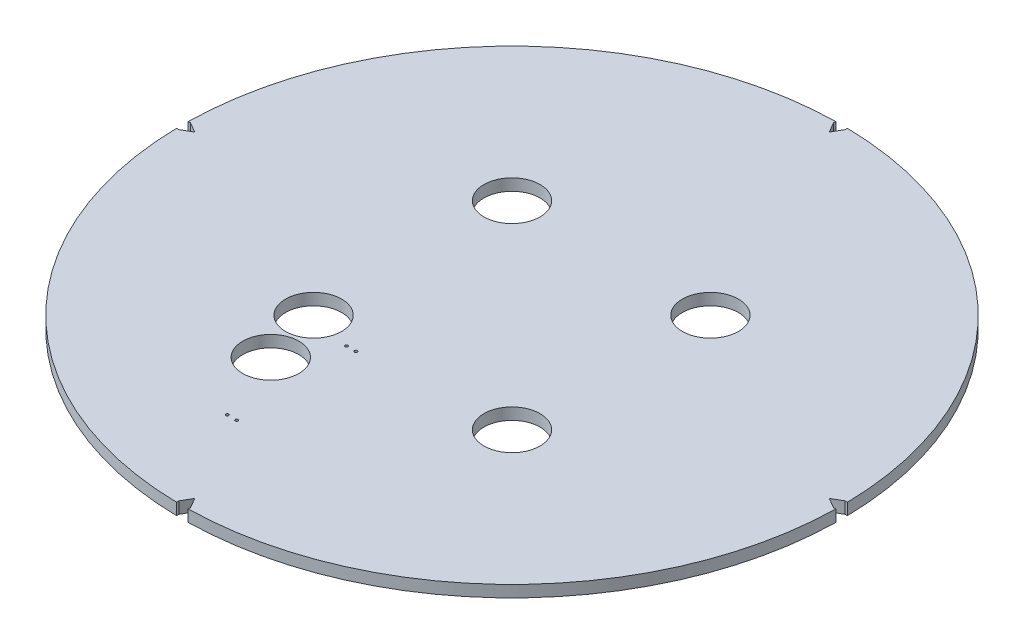
ISO-10303-21;
HEADER;
FILE_DESCRIPTION(('STEP AP214'),'2;1');
FILE_NAME('part.step','',(''),(''),'','','');
FILE_SCHEMA(('AUTOMOTIVE_DESIGN { 1 0 10303 214 1 1 1 1 }'));
ENDSEC;
DATA;
#1=APPLICATION_CONTEXT('core data for automotive mechanical design processes');
#2=APPLICATION_PROTOCOL_DEFINITION('international standard','automotive_design',2000,#1);
#3=PRODUCT_CONTEXT('',#1,'mechanical');
#4=PRODUCT('Part','Part','',(#3));
#5=PRODUCT_RELATED_PRODUCT_CATEGORY('part','',(#4));
#6=PRODUCT_DEFINITION_FORMATION('','',#4);
#7=PRODUCT_DEFINITION_CONTEXT('part definition',#1,'design');
#8=PRODUCT_DEFINITION('design','',#6,#7);
#9=PRODUCT_DEFINITION_SHAPE('','',#8);
#10=(LENGTH_UNIT() NAMED_UNIT(*) SI_UNIT(.MILLI.,.METRE.));
#11=(NAMED_UNIT(*) PLANE_ANGLE_UNIT() SI_UNIT($,.RADIAN.));
#12=(NAMED_UNIT(*) SI_UNIT($,.STERADIAN.) SOLID_ANGLE_UNIT());
#13=UNCERTAINTY_MEASURE_WITH_UNIT(LENGTH_MEASURE(1.E-05),#10,'distance_accuracy_value','');
#14=(GEOMETRIC_REPRESENTATION_CONTEXT(3) GLOBAL_UNCERTAINTY_ASSIGNED_CONTEXT((#13)) GLOBAL_UNIT_ASSIGNED_CONTEXT((#10,
#11,#12)) REPRESENTATION_CONTEXT('',''));
#15=CARTESIAN_POINT('',(0.,0.,0.));
#16=DIRECTION('',(0.,0.,1.));
#17=DIRECTION('',(1.,0.,0.));
#18=AXIS2_PLACEMENT_3D('',#15,#16,#17);
#19=CARTESIAN_POINT('',(0.,25.,0.));
#20=DIRECTION('',(0.,1.,0.));
#21=DIRECTION('',(0.,0.,1.));
#22=AXIS2_PLACEMENT_3D('',#19,#20,#21);
#23=PLANE('',#22);
#24=CARTESIAN_POINT('',(-119.993569405085,25.,488.765285361642));
#25=DIRECTION('',(0.,1.,0.));
#26=DIRECTION('',(0.,0.,1.));
#27=AXIS2_PLACEMENT_3D('',#24,#25,#26);
#28=CIRCLE('',#27,3.00000000000001);
#29=CARTESIAN_POINT('',(-119.993569405085,25.,491.765285361642));
#30=VERTEX_POINT('',#29);
#31=EDGE_CURVE('E478',#30,#30,#28,.F.);
#32=ORIENTED_EDGE('',*,*,#31,.T.);
#33=EDGE_LOOP('',(#32));
#34=FACE_BOUND('',#33,.T.);
#35=CARTESIAN_POINT('',(-119.993569405085,25.,233.765285361642));
#36=DIRECTION('',(0.,1.,0.));
#37=DIRECTION('',(0.,0.,1.));
#38=AXIS2_PLACEMENT_3D('',#35,#36,#37);
#39=CIRCLE('',#38,3.00000000000001);
#40=CARTESIAN_POINT('',(-119.993569405085,25.,236.765285361642));
#41=VERTEX_POINT('',#40);
#42=EDGE_CURVE('E484',#41,#41,#39,.F.);
#43=ORIENTED_EDGE('',*,*,#42,.T.);
#44=EDGE_LOOP('',(#43));
#45=FACE_BOUND('',#44,.T.);
#46=CARTESIAN_POINT('',(-179.993569405085,25.,335.765285361642));
#47=DIRECTION('',(0.,1.,0.));
#48=DIRECTION('',(0.,0.,1.));
#49=AXIS2_PLACEMENT_3D('',#46,#47,#48);
#50=CIRCLE('',#49,60.);
#51=CARTESIAN_POINT('',(-179.993569405085,25.,395.765285361642));
#52=VERTEX_POINT('',#51);
#53=EDGE_CURVE('E495',#52,#52,#50,.T.);
#54=ORIENTED_EDGE('',*,*,#53,.F.);
#55=EDGE_LOOP('',(#54));
#56=FACE_BOUND('',#55,.T.);
#57=CARTESIAN_POINT('',(212.132034355964,25.,-212.132034355964));
#58=DIRECTION('',(0.,1.,0.));
#59=DIRECTION('',(0.,0.,1.));
#60=AXIS2_PLACEMENT_3D('',#57,#58,#59);
#61=CIRCLE('',#60,60.);
#62=CARTESIAN_POINT('',(212.132034355964,25.,-152.132034355964));
#63=VERTEX_POINT('',#62);
#64=EDGE_CURVE('E501',#63,#63,#61,.T.);
#65=ORIENTED_EDGE('',*,*,#64,.F.);
#66=EDGE_LOOP('',(#65));
#67=FACE_BOUND('',#66,.T.);
#68=CARTESIAN_POINT('',(-212.132034355964,25.,-212.132034355964));
#69=DIRECTION('',(0.,1.,0.));
#70=DIRECTION('',(0.,0.,1.));
#71=AXIS2_PLACEMENT_3D('',#68,#69,#70);
#72=CIRCLE('',#71,60.);
#73=CARTESIAN_POINT('',(-212.132034355964,25.,-152.132034355964));
#74=VERTEX_POINT('',#73);
#75=EDGE_CURVE('E512',#74,#74,#72,.T.);
#76=ORIENTED_EDGE('',*,*,#75,.F.);
#77=EDGE_LOOP('',(#76));
#78=FACE_BOUND('',#77,.T.);
#79=CARTESIAN_POINT('',(-212.132034355964,25.,212.132034355964));
#80=DIRECTION('',(0.,1.,0.));
#81=DIRECTION('',(0.,0.,1.));
#82=AXIS2_PLACEMENT_3D('',#79,#80,#81);
#83=CIRCLE('',#82,60.);
#84=CARTESIAN_POINT('',(-212.132034355964,25.,272.132034355964));
#85=VERTEX_POINT('',#84);
#86=EDGE_CURVE('E504',#85,#85,#83,.T.);
#87=ORIENTED_EDGE('',*,*,#86,.F.);
#88=EDGE_LOOP('',(#87));
#89=FACE_BOUND('',#88,.T.);
#90=CARTESIAN_POINT('',(212.132034355964,25.,212.132034355964));
#91=DIRECTION('',(0.,1.,0.));
#92=DIRECTION('',(0.,0.,1.));
#93=AXIS2_PLACEMENT_3D('',#90,#91,#92);
#94=CIRCLE('',#93,60.);
#95=CARTESIAN_POINT('',(212.132034355964,25.,272.132034355964));
#96=VERTEX_POINT('',#95);
#97=EDGE_CURVE('E511',#96,#96,#94,.T.);
#98=ORIENTED_EDGE('',*,*,#97,.F.);
#99=EDGE_LOOP('',(#98));
#100=FACE_BOUND('',#99,.T.);
#101=DIRECTION('',(1.,0.,0.));
#102=VECTOR('',#101,1.);
#103=CARTESIAN_POINT('',(-699.994189271292,25.,12.4999999999935));
#104=LINE('',#103,#102);
#105=CARTESIAN_POINT('',(-704.889175686505,25.,12.4999999999935));
#106=VERTEX_POINT('',#105);
#107=CARTESIAN_POINT('',(-699.994189271292,25.,12.4999999999935));
#108=VERTEX_POINT('',#107);
#109=EDGE_CURVE('E214',#106,#108,#104,.T.);
#110=ORIENTED_EDGE('',*,*,#109,.F.);
#111=CARTESIAN_POINT('',(0.,25.,0.));
#112=DIRECTION('',(0.,1.,0.));
#113=DIRECTION('',(0.,0.,1.));
#114=AXIS2_PLACEMENT_3D('',#111,#112,#113);
#115=CIRCLE('',#114,705.);
#116=CARTESIAN_POINT('',(-12.5000000000039,25.,704.889175686505));
#117=VERTEX_POINT('',#116);
#118=EDGE_CURVE('E45',#106,#117,#115,.T.);
#119=ORIENTED_EDGE('',*,*,#118,.T.);
#120=DIRECTION('',(0.,0.,1.));
#121=VECTOR('',#120,1.);
#122=CARTESIAN_POINT('',(-12.5000000000039,25.,699.994189271326));
#123=LINE('',#122,#121);
#124=CARTESIAN_POINT('',(-12.5000000000039,25.,699.994189271326));
#125=VERTEX_POINT('',#124);
#126=EDGE_CURVE('E295',#125,#117,#123,.T.);
#127=ORIENTED_EDGE('',*,*,#126,.F.);
#128=DIRECTION('',(-0.500000000000008,0.,0.866025403784434));
#129=VECTOR('',#128,1.);
#130=CARTESIAN_POINT('',(1.75263706108031E-11,25.,678.343554176678));
#131=LINE('',#130,#129);
#132=CARTESIAN_POINT('',(1.75263706108031E-11,25.,678.343554176678));
#133=VERTEX_POINT('',#132);
#134=EDGE_CURVE('E292',#133,#125,#131,.T.);
#135=ORIENTED_EDGE('',*,*,#134,.F.);
#136=DIRECTION('',(-0.499999999999294,0.,-0.866025403784846));
#137=VECTOR('',#136,1.);
#138=CARTESIAN_POINT('',(12.499999999996,25.,699.994189271292));
#139=LINE('',#138,#137);
#140=CARTESIAN_POINT('',(12.499999999996,25.,699.994189271292));
#141=VERTEX_POINT('',#140);
#142=EDGE_CURVE('E301',#141,#133,#139,.T.);
#143=ORIENTED_EDGE('',*,*,#142,.F.);
#144=DIRECTION('',(0.,0.,-1.));
#145=VECTOR('',#144,1.);
#146=CARTESIAN_POINT('',(12.499999999996,25.,699.994189271292));
#147=LINE('',#146,#145);
#148=CARTESIAN_POINT('',(12.499999999996,25.,704.889175686505));
#149=VERTEX_POINT('',#148);
#150=EDGE_CURVE('E298',#149,#141,#147,.T.);
#151=ORIENTED_EDGE('',*,*,#150,.F.);
#152=CARTESIAN_POINT('',(704.889175686504,25.,12.5000000000113));
#153=VERTEX_POINT('',#152);
#154=EDGE_CURVE('E11',#149,#153,#115,.T.);
#155=ORIENTED_EDGE('',*,*,#154,.T.);
#156=DIRECTION('',(1.,0.,0.));
#157=VECTOR('',#156,1.);
#158=CARTESIAN_POINT('',(699.994189271326,25.,12.5000000000112));
#159=LINE('',#158,#157);
#160=CARTESIAN_POINT('',(699.994189271326,25.,12.5000000000112));
#161=VERTEX_POINT('',#160);
#162=EDGE_CURVE('E264',#161,#153,#159,.T.);
#163=ORIENTED_EDGE('',*,*,#162,.F.);
#164=DIRECTION('',(0.866025403784428,0.,0.500000000000017));
#165=VECTOR('',#164,1.);
#166=CARTESIAN_POINT('',(678.343554176678,25.,-1.04210990286059E-11));
#167=LINE('',#166,#165);
#168=CARTESIAN_POINT('',(678.343554176678,25.,-1.04210990286059E-11));
#169=VERTEX_POINT('',#168);
#170=EDGE_CURVE('E261',#169,#161,#167,.T.);
#171=ORIENTED_EDGE('',*,*,#170,.F.);
#172=DIRECTION('',(-0.866025403784851,0.,0.499999999999285));
#173=VECTOR('',#172,1.);
#174=CARTESIAN_POINT('',(699.994189271293,25.,-12.4999999999887));
#175=LINE('',#174,#173);
#176=CARTESIAN_POINT('',(699.994189271293,25.,-12.4999999999887));
#177=VERTEX_POINT('',#176);
#178=EDGE_CURVE('E269',#177,#169,#175,.T.);
#179=ORIENTED_EDGE('',*,*,#178,.F.);
#180=DIRECTION('',(-1.,0.,0.));
#181=VECTOR('',#180,1.);
#182=CARTESIAN_POINT('',(699.994189271293,25.,-12.4999999999887));
#183=LINE('',#182,#181);
#184=CARTESIAN_POINT('',(704.889175686505,25.,-12.4999999999886));
#185=VERTEX_POINT('',#184);
#186=EDGE_CURVE('E266',#185,#177,#183,.T.);
#187=ORIENTED_EDGE('',*,*,#186,.F.);
#188=CARTESIAN_POINT('',(12.5000000000039,25.,-704.889175686505));
#189=VERTEX_POINT('',#188);
#190=EDGE_CURVE('E44',#185,#189,#115,.T.);
#191=ORIENTED_EDGE('',*,*,#190,.T.);
#192=DIRECTION('',(0.,0.,-1.));
#193=VECTOR('',#192,1.);
#194=CARTESIAN_POINT('',(12.5000000000039,25.,-699.994189271326));
#195=LINE('',#194,#193);
#196=CARTESIAN_POINT('',(12.5000000000039,25.,-699.994189271326));
#197=VERTEX_POINT('',#196);
#198=EDGE_CURVE('E237',#197,#189,#195,.T.);
#199=ORIENTED_EDGE('',*,*,#198,.F.);
#200=DIRECTION('',(0.500000000000008,0.,-0.866025403784434));
#201=VECTOR('',#200,1.);
#202=CARTESIAN_POINT('',(-1.75263706108031E-11,25.,-678.343554176678));
#203=LINE('',#202,#201);
#204=CARTESIAN_POINT('',(-1.75263706108031E-11,25.,-678.343554176678));
#205=VERTEX_POINT('',#204);
#206=EDGE_CURVE('E234',#205,#197,#203,.T.);
#207=ORIENTED_EDGE('',*,*,#206,.F.);
#208=DIRECTION('',(0.499999999999294,0.,0.866025403784846));
#209=VECTOR('',#208,1.);
#210=CARTESIAN_POINT('',(-12.499999999996,25.,-699.994189271292));
#211=LINE('',#210,#209);
#212=CARTESIAN_POINT('',(-12.499999999996,25.,-699.994189271292));
#213=VERTEX_POINT('',#212);
#214=EDGE_CURVE('E242',#213,#205,#211,.T.);
#215=ORIENTED_EDGE('',*,*,#214,.F.);
#216=DIRECTION('',(0.,0.,1.));
#217=VECTOR('',#216,1.);
#218=CARTESIAN_POINT('',(-12.499999999996,25.,-699.994189271292));
#219=LINE('',#218,#217);
#220=CARTESIAN_POINT('',(-12.499999999996,25.,-704.889175686505));
#221=VERTEX_POINT('',#220);
#222=EDGE_CURVE('E239',#221,#213,#219,.T.);
#223=ORIENTED_EDGE('',*,*,#222,.F.);
#224=CARTESIAN_POINT('',(-704.889175686505,25.,-12.5000000000064));
#225=VERTEX_POINT('',#224);
#226=EDGE_CURVE('E330',#221,#225,#115,.T.);
#227=ORIENTED_EDGE('',*,*,#226,.T.);
#228=DIRECTION('',(-1.,0.,0.));
#229=VECTOR('',#228,1.);
#230=CARTESIAN_POINT('',(-699.994189271326,25.,-12.5000000000063));
#231=LINE('',#230,#229);
#232=CARTESIAN_POINT('',(-699.994189271326,25.,-12.5000000000063));
#233=VERTEX_POINT('',#232);
#234=EDGE_CURVE('E212',#233,#225,#231,.T.);
#235=ORIENTED_EDGE('',*,*,#234,.F.);
#236=DIRECTION('',(-0.866025403784432,0.,-0.500000000000011));
#237=VECTOR('',#236,1.);
#238=CARTESIAN_POINT('',(-678.343554176678,25.,1.51579467500707E-11));
#239=LINE('',#238,#237);
#240=CARTESIAN_POINT('',(-678.343554176678,25.,1.51579467500707E-11));
#241=VERTEX_POINT('',#240);
#242=EDGE_CURVE('E182',#241,#233,#239,.T.);
#243=ORIENTED_EDGE('',*,*,#242,.F.);
#244=DIRECTION('',(0.866025403784848,0.,-0.499999999999291));
#245=VECTOR('',#244,1.);
#246=CARTESIAN_POINT('',(-699.994189271292,25.,12.4999999999935));
#247=LINE('',#246,#245);
#248=EDGE_CURVE('E184',#108,#241,#247,.T.);
#249=ORIENTED_EDGE('',*,*,#248,.F.);
#250=EDGE_LOOP('',(#110,#119,#127,#135,#143,#151,#155,#163,#171,#179,#187,#191,#199,#207,#215,
#223,#227,#235,#243,#249));
#251=FACE_BOUND('',#250,.T.);
#252=CARTESIAN_POINT('',(-99.9935694050845,25.,488.765285361642));
#253=DIRECTION('',(0.,1.,0.));
#254=DIRECTION('',(0.,0.,1.));
#255=AXIS2_PLACEMENT_3D('',#252,#253,#254);
#256=CIRCLE('',#255,3.00000000000001);
#257=CARTESIAN_POINT('',(-99.9935694050845,25.,491.765285361642));
#258=VERTEX_POINT('',#257);
#259=EDGE_CURVE('E476',#258,#258,#256,.T.);
#260=ORIENTED_EDGE('',*,*,#259,.F.);
#261=EDGE_LOOP('',(#260));
#262=FACE_BOUND('',#261,.T.);
#263=CARTESIAN_POINT('',(-99.9935694050845,25.,233.765285361642));
#264=DIRECTION('',(0.,1.,0.));
#265=DIRECTION('',(0.,0.,1.));
#266=AXIS2_PLACEMENT_3D('',#263,#264,#265);
#267=CIRCLE('',#266,3.00000000000001);
#268=CARTESIAN_POINT('',(-99.9935694050845,25.,236.765285361642));
#269=VERTEX_POINT('',#268);
#270=EDGE_CURVE('E485',#269,#269,#267,.T.);
#271=ORIENTED_EDGE('',*,*,#270,.F.);
#272=EDGE_LOOP('',(#271));
#273=FACE_BOUND('',#272,.T.);
#274=ADVANCED_FACE('F35',(#34,#45,#56,#67,#78,#89,#100,#251,#262,#273),#23,.T.);
#275=CARTESIAN_POINT('',(0.,0.,0.));
#276=DIRECTION('',(0.,1.,0.));
#277=DIRECTION('',(0.,0.,1.));
#278=AXIS2_PLACEMENT_3D('',#275,#276,#277);
#279=PLANE('',#278);
#280=CARTESIAN_POINT('',(-99.9935694050845,0.,488.765285361642));
#281=DIRECTION('',(0.,1.,0.));
#282=DIRECTION('',(0.,0.,1.));
#283=AXIS2_PLACEMENT_3D('',#280,#281,#282);
#284=CIRCLE('',#283,3.00000000000001);
#285=CARTESIAN_POINT('',(-99.9935694050845,0.,491.765285361642));
#286=VERTEX_POINT('',#285);
#287=EDGE_CURVE('E473',#286,#286,#284,.T.);
#288=ORIENTED_EDGE('',*,*,#287,.T.);
#289=EDGE_LOOP('',(#288));
#290=FACE_BOUND('',#289,.T.);
#291=CARTESIAN_POINT('',(-119.993569405085,0.,233.765285361642));
#292=DIRECTION('',(0.,1.,0.));
#293=DIRECTION('',(0.,0.,1.));
#294=AXIS2_PLACEMENT_3D('',#291,#292,#293);
#295=CIRCLE('',#294,3.00000000000001);
#296=CARTESIAN_POINT('',(-119.993569405085,0.,236.765285361642));
#297=VERTEX_POINT('',#296);
#298=EDGE_CURVE('E492',#297,#297,#295,.F.);
#299=ORIENTED_EDGE('',*,*,#298,.F.);
#300=EDGE_LOOP('',(#299));
#301=FACE_BOUND('',#300,.T.);
#302=CARTESIAN_POINT('',(-179.993569405085,0.,335.765285361642));
#303=DIRECTION('',(0.,1.,0.));
#304=DIRECTION('',(0.,0.,1.));
#305=AXIS2_PLACEMENT_3D('',#302,#303,#304);
#306=CIRCLE('',#305,60.);
#307=CARTESIAN_POINT('',(-179.993569405085,0.,395.765285361642));
#308=VERTEX_POINT('',#307);
#309=EDGE_CURVE('E498',#308,#308,#306,.T.);
#310=ORIENTED_EDGE('',*,*,#309,.T.);
#311=EDGE_LOOP('',(#310));
#312=FACE_BOUND('',#311,.T.);
#313=CARTESIAN_POINT('',(212.132034355964,0.,-212.132034355964));
#314=DIRECTION('',(0.,1.,0.));
#315=DIRECTION('',(0.,0.,1.));
#316=AXIS2_PLACEMENT_3D('',#313,#314,#315);
#317=CIRCLE('',#316,60.);
#318=CARTESIAN_POINT('',(212.132034355964,0.,-152.132034355964));
#319=VERTEX_POINT('',#318);
#320=EDGE_CURVE('E515',#319,#319,#317,.F.);
#321=ORIENTED_EDGE('',*,*,#320,.F.);
#322=EDGE_LOOP('',(#321));
#323=FACE_BOUND('',#322,.T.);
#324=CARTESIAN_POINT('',(-212.132034355964,0.,-212.132034355964));
#325=DIRECTION('',(0.,1.,0.));
#326=DIRECTION('',(0.,0.,1.));
#327=AXIS2_PLACEMENT_3D('',#324,#325,#326);
#328=CIRCLE('',#327,60.);
#329=CARTESIAN_POINT('',(-212.132034355964,0.,-152.132034355964));
#330=VERTEX_POINT('',#329);
#331=EDGE_CURVE('E508',#330,#330,#328,.F.);
#332=ORIENTED_EDGE('',*,*,#331,.F.);
#333=EDGE_LOOP('',(#332));
#334=FACE_BOUND('',#333,.T.);
#335=CARTESIAN_POINT('',(-212.132034355964,0.,212.132034355964));
#336=DIRECTION('',(0.,1.,0.));
#337=DIRECTION('',(0.,0.,1.));
#338=AXIS2_PLACEMENT_3D('',#335,#336,#337);
#339=CIRCLE('',#338,60.);
#340=CARTESIAN_POINT('',(-212.132034355964,0.,272.132034355964));
#341=VERTEX_POINT('',#340);
#342=EDGE_CURVE('E507',#341,#341,#339,.F.);
#343=ORIENTED_EDGE('',*,*,#342,.F.);
#344=EDGE_LOOP('',(#343));
#345=FACE_BOUND('',#344,.T.);
#346=CARTESIAN_POINT('',(212.132034355964,0.,212.132034355964));
#347=DIRECTION('',(0.,1.,0.));
#348=DIRECTION('',(0.,0.,1.));
#349=AXIS2_PLACEMENT_3D('',#346,#347,#348);
#350=CIRCLE('',#349,60.);
#351=CARTESIAN_POINT('',(212.132034355964,0.,272.132034355964));
#352=VERTEX_POINT('',#351);
#353=EDGE_CURVE('E207',#352,#352,#350,.F.);
#354=ORIENTED_EDGE('',*,*,#353,.F.);
#355=EDGE_LOOP('',(#354));
#356=FACE_BOUND('',#355,.T.);
#357=CARTESIAN_POINT('',(0.,0.,0.));
#358=DIRECTION('',(0.,1.,0.));
#359=DIRECTION('',(0.,0.,1.));
#360=AXIS2_PLACEMENT_3D('',#357,#358,#359);
#361=CIRCLE('',#360,705.);
#362=CARTESIAN_POINT('',(-704.889175686505,0.,12.4999999999935));
#363=VERTEX_POINT('',#362);
#364=CARTESIAN_POINT('',(-12.5000000000039,0.,704.889175686505));
#365=VERTEX_POINT('',#364);
#366=EDGE_CURVE('E317',#363,#365,#361,.T.);
#367=ORIENTED_EDGE('',*,*,#366,.F.);
#368=DIRECTION('',(-1.,0.,0.));
#369=VECTOR('',#368,1.);
#370=CARTESIAN_POINT('',(-699.994189271292,0.,12.4999999999935));
#371=LINE('',#370,#369);
#372=CARTESIAN_POINT('',(-699.994189271292,0.,12.4999999999935));
#373=VERTEX_POINT('',#372);
#374=EDGE_CURVE('E202',#373,#363,#371,.T.);
#375=ORIENTED_EDGE('',*,*,#374,.F.);
#376=DIRECTION('',(-0.866025403784848,0.,0.499999999999291));
#377=VECTOR('',#376,1.);
#378=CARTESIAN_POINT('',(-699.994189271292,0.,12.4999999999935));
#379=LINE('',#378,#377);
#380=CARTESIAN_POINT('',(-678.343554176678,0.,1.51579467500707E-11));
#381=VERTEX_POINT('',#380);
#382=EDGE_CURVE('E199',#381,#373,#379,.T.);
#383=ORIENTED_EDGE('',*,*,#382,.F.);
#384=DIRECTION('',(0.866025403784432,0.,0.500000000000012));
#385=VECTOR('',#384,1.);
#386=CARTESIAN_POINT('',(-678.343554176678,0.,1.51579467500707E-11));
#387=LINE('',#386,#385);
#388=CARTESIAN_POINT('',(-699.994189271326,0.,-12.5000000000063));
#389=VERTEX_POINT('',#388);
#390=EDGE_CURVE('E179',#389,#381,#387,.T.);
#391=ORIENTED_EDGE('',*,*,#390,.F.);
#392=DIRECTION('',(1.,0.,0.));
#393=VECTOR('',#392,1.);
#394=CARTESIAN_POINT('',(-699.994189271326,0.,-12.5000000000063));
#395=LINE('',#394,#393);
#396=CARTESIAN_POINT('',(-704.889175686505,0.,-12.5000000000064));
#397=VERTEX_POINT('',#396);
#398=EDGE_CURVE('E186',#397,#389,#395,.T.);
#399=ORIENTED_EDGE('',*,*,#398,.F.);
#400=CARTESIAN_POINT('',(-12.499999999996,0.,-704.889175686505));
#401=VERTEX_POINT('',#400);
#402=EDGE_CURVE('E322',#401,#397,#361,.T.);
#403=ORIENTED_EDGE('',*,*,#402,.F.);
#404=DIRECTION('',(0.,0.,-1.));
#405=VECTOR('',#404,1.);
#406=CARTESIAN_POINT('',(-12.499999999996,0.,-699.994189271292));
#407=LINE('',#406,#405);
#408=CARTESIAN_POINT('',(-12.499999999996,0.,-699.994189271292));
#409=VERTEX_POINT('',#408);
#410=EDGE_CURVE('E232',#409,#401,#407,.T.);
#411=ORIENTED_EDGE('',*,*,#410,.F.);
#412=DIRECTION('',(-0.499999999999294,0.,-0.866025403784846));
#413=VECTOR('',#412,1.);
#414=CARTESIAN_POINT('',(-12.499999999996,0.,-699.994189271292));
#415=LINE('',#414,#413);
#416=CARTESIAN_POINT('',(-1.75263706108031E-11,0.,-678.343554176678));
#417=VERTEX_POINT('',#416);
#418=EDGE_CURVE('E228',#417,#409,#415,.T.);
#419=ORIENTED_EDGE('',*,*,#418,.F.);
#420=DIRECTION('',(-0.500000000000008,0.,0.866025403784434));
#421=VECTOR('',#420,1.);
#422=CARTESIAN_POINT('',(-1.75263706108031E-11,0.,-678.343554176678));
#423=LINE('',#422,#421);
#424=CARTESIAN_POINT('',(12.5000000000039,0.,-699.994189271326));
#425=VERTEX_POINT('',#424);
#426=EDGE_CURVE('E225',#425,#417,#423,.T.);
#427=ORIENTED_EDGE('',*,*,#426,.F.);
#428=DIRECTION('',(0.,0.,1.));
#429=VECTOR('',#428,1.);
#430=CARTESIAN_POINT('',(12.5000000000039,0.,-699.994189271326));
#431=LINE('',#430,#429);
#432=CARTESIAN_POINT('',(12.5000000000039,0.,-704.889175686505));
#433=VERTEX_POINT('',#432);
#434=EDGE_CURVE('E200',#433,#425,#431,.T.);
#435=ORIENTED_EDGE('',*,*,#434,.F.);
#436=CARTESIAN_POINT('',(704.889175686505,0.,-12.4999999999886));
#437=VERTEX_POINT('',#436);
#438=EDGE_CURVE('E325',#437,#433,#361,.T.);
#439=ORIENTED_EDGE('',*,*,#438,.F.);
#440=DIRECTION('',(1.,0.,0.));
#441=VECTOR('',#440,1.);
#442=CARTESIAN_POINT('',(699.994189271293,0.,-12.4999999999887));
#443=LINE('',#442,#441);
#444=CARTESIAN_POINT('',(699.994189271293,0.,-12.4999999999887));
#445=VERTEX_POINT('',#444);
#446=EDGE_CURVE('E259',#445,#437,#443,.T.);
#447=ORIENTED_EDGE('',*,*,#446,.F.);
#448=DIRECTION('',(0.866025403784851,0.,-0.499999999999285));
#449=VECTOR('',#448,1.);
#450=CARTESIAN_POINT('',(699.994189271293,0.,-12.4999999999887));
#451=LINE('',#450,#449);
#452=CARTESIAN_POINT('',(678.343554176678,0.,-1.04210990286059E-11));
#453=VERTEX_POINT('',#452);
#454=EDGE_CURVE('E256',#453,#445,#451,.T.);
#455=ORIENTED_EDGE('',*,*,#454,.F.);
#456=DIRECTION('',(-0.866025403784428,0.,-0.500000000000018));
#457=VECTOR('',#456,1.);
#458=CARTESIAN_POINT('',(678.343554176678,0.,-1.04210990286059E-11));
#459=LINE('',#458,#457);
#460=CARTESIAN_POINT('',(699.994189271326,0.,12.5000000000112));
#461=VERTEX_POINT('',#460);
#462=EDGE_CURVE('E253',#461,#453,#459,.T.);
#463=ORIENTED_EDGE('',*,*,#462,.F.);
#464=DIRECTION('',(-1.,0.,0.));
#465=VECTOR('',#464,1.);
#466=CARTESIAN_POINT('',(699.994189271326,0.,12.5000000000112));
#467=LINE('',#466,#465);
#468=CARTESIAN_POINT('',(704.889175686504,0.,12.5000000000113));
#469=VERTEX_POINT('',#468);
#470=EDGE_CURVE('E229',#469,#461,#467,.T.);
#471=ORIENTED_EDGE('',*,*,#470,.F.);
#472=CARTESIAN_POINT('',(12.499999999996,0.,704.889175686505));
#473=VERTEX_POINT('',#472);
#474=EDGE_CURVE('E39',#473,#469,#361,.T.);
#475=ORIENTED_EDGE('',*,*,#474,.F.);
#476=DIRECTION('',(0.,0.,1.));
#477=VECTOR('',#476,1.);
#478=CARTESIAN_POINT('',(12.499999999996,0.,699.994189271292));
#479=LINE('',#478,#477);
#480=CARTESIAN_POINT('',(12.499999999996,0.,699.994189271292));
#481=VERTEX_POINT('',#480);
#482=EDGE_CURVE('E290',#481,#473,#479,.T.);
#483=ORIENTED_EDGE('',*,*,#482,.F.);
#484=DIRECTION('',(0.499999999999294,0.,0.866025403784846));
#485=VECTOR('',#484,1.);
#486=CARTESIAN_POINT('',(12.499999999996,0.,699.994189271292));
#487=LINE('',#486,#485);
#488=CARTESIAN_POINT('',(1.75263706108031E-11,0.,678.343554176678));
#489=VERTEX_POINT('',#488);
#490=EDGE_CURVE('E287',#489,#481,#487,.T.);
#491=ORIENTED_EDGE('',*,*,#490,.F.);
#492=DIRECTION('',(0.500000000000008,0.,-0.866025403784434));
#493=VECTOR('',#492,1.);
#494=CARTESIAN_POINT('',(1.75263706108031E-11,0.,678.343554176678));
#495=LINE('',#494,#493);
#496=CARTESIAN_POINT('',(-12.5000000000039,0.,699.994189271326));
#497=VERTEX_POINT('',#496);
#498=EDGE_CURVE('E191',#497,#489,#495,.T.);
#499=ORIENTED_EDGE('',*,*,#498,.F.);
#500=DIRECTION('',(0.,0.,-1.));
#501=VECTOR('',#500,1.);
#502=CARTESIAN_POINT('',(-12.5000000000039,0.,699.994189271326));
#503=LINE('',#502,#501);
#504=EDGE_CURVE('E307',#365,#497,#503,.T.);
#505=ORIENTED_EDGE('',*,*,#504,.F.);
#506=EDGE_LOOP('',(#367,#375,#383,#391,#399,#403,#411,#419,#427,#435,#439,#447,#455,#463,#471,
#475,#483,#491,#499,#505));
#507=FACE_BOUND('',#506,.T.);
#508=CARTESIAN_POINT('',(-119.993569405085,0.,488.765285361642));
#509=DIRECTION('',(0.,1.,0.));
#510=DIRECTION('',(0.,0.,1.));
#511=AXIS2_PLACEMENT_3D('',#508,#509,#510);
#512=CIRCLE('',#511,3.00000000000001);
#513=CARTESIAN_POINT('',(-119.993569405085,0.,491.765285361642));
#514=VERTEX_POINT('',#513);
#515=EDGE_CURVE('E488',#514,#514,#512,.F.);
#516=ORIENTED_EDGE('',*,*,#515,.F.);
#517=EDGE_LOOP('',(#516));
#518=FACE_BOUND('',#517,.T.);
#519=CARTESIAN_POINT('',(-99.9935694050845,0.,233.765285361642));
#520=DIRECTION('',(0.,1.,0.));
#521=DIRECTION('',(0.,0.,1.));
#522=AXIS2_PLACEMENT_3D('',#519,#520,#521);
#523=CIRCLE('',#522,3.00000000000001);
#524=CARTESIAN_POINT('',(-99.9935694050845,0.,236.765285361642));
#525=VERTEX_POINT('',#524);
#526=EDGE_CURVE('E481',#525,#525,#523,.T.);
#527=ORIENTED_EDGE('',*,*,#526,.T.);
#528=EDGE_LOOP('',(#527));
#529=FACE_BOUND('',#528,.T.);
#530=ADVANCED_FACE('F195',(#290,#301,#312,#323,#334,#345,#356,#507,#518,#529),#279,.F.);
#531=CARTESIAN_POINT('',(0.,25.,0.));
#532=DIRECTION('',(0.,-1.,0.));
#533=DIRECTION('',(0.,0.,-1.));
#534=AXIS2_PLACEMENT_3D('',#531,#532,#533);
#535=CYLINDRICAL_SURFACE('',#534,705.);
#536=ORIENTED_EDGE('',*,*,#118,.F.);
#537=DIRECTION('',(0.,1.,0.));
#538=VECTOR('',#537,1.);
#539=CARTESIAN_POINT('',(-704.889175686505,-0.001000000000001,12.4999999999935));
#540=LINE('',#539,#538);
#541=EDGE_CURVE('E222',#363,#106,#540,.T.);
#542=ORIENTED_EDGE('',*,*,#541,.F.);
#543=ORIENTED_EDGE('',*,*,#366,.T.);
#544=DIRECTION('',(0.,1.,0.));
#545=VECTOR('',#544,1.);
#546=CARTESIAN_POINT('',(-12.5000000000039,-0.001000000000001,704.889175686505));
#547=LINE('',#546,#545);
#548=EDGE_CURVE('E312',#365,#117,#547,.T.);
#549=ORIENTED_EDGE('',*,*,#548,.T.);
#550=EDGE_LOOP('',(#536,#542,#543,#549));
#551=FACE_BOUND('',#550,.T.);
#552=ADVANCED_FACE('F381',(#551),#535,.T.);
#553=ORIENTED_EDGE('',*,*,#402,.T.);
#554=DIRECTION('',(0.,1.,0.));
#555=VECTOR('',#554,1.);
#556=CARTESIAN_POINT('',(-704.889175686505,-0.001000000000001,-12.5000000000064));
#557=LINE('',#556,#555);
#558=EDGE_CURVE('E52',#397,#225,#557,.T.);
#559=ORIENTED_EDGE('',*,*,#558,.T.);
#560=ORIENTED_EDGE('',*,*,#226,.F.);
#561=DIRECTION('',(0.,1.,0.));
#562=VECTOR('',#561,1.);
#563=CARTESIAN_POINT('',(-12.499999999996,-0.001000000000001,-704.889175686505));
#564=LINE('',#563,#562);
#565=EDGE_CURVE('E249',#401,#221,#564,.T.);
#566=ORIENTED_EDGE('',*,*,#565,.F.);
#567=EDGE_LOOP('',(#553,#559,#560,#566));
#568=FACE_BOUND('',#567,.T.);
#569=ADVANCED_FACE('F358',(#568),#535,.T.);
#570=ORIENTED_EDGE('',*,*,#438,.T.);
#571=DIRECTION('',(0.,1.,0.));
#572=VECTOR('',#571,1.);
#573=CARTESIAN_POINT('',(12.5000000000039,-0.001000000000001,-704.889175686505));
#574=LINE('',#573,#572);
#575=EDGE_CURVE('E60',#433,#189,#574,.T.);
#576=ORIENTED_EDGE('',*,*,#575,.T.);
#577=ORIENTED_EDGE('',*,*,#190,.F.);
#578=DIRECTION('',(0.,1.,0.));
#579=VECTOR('',#578,1.);
#580=CARTESIAN_POINT('',(704.889175686505,-0.001000000000001,-12.4999999999886));
#581=LINE('',#580,#579);
#582=EDGE_CURVE('E277',#437,#185,#581,.T.);
#583=ORIENTED_EDGE('',*,*,#582,.F.);
#584=EDGE_LOOP('',(#570,#576,#577,#583));
#585=FACE_BOUND('',#584,.T.);
#586=ADVANCED_FACE('F335',(#585),#535,.T.);
#587=ORIENTED_EDGE('',*,*,#474,.T.);
#588=DIRECTION('',(0.,1.,0.));
#589=VECTOR('',#588,1.);
#590=CARTESIAN_POINT('',(704.889175686504,-0.001000000000001,12.5000000000113));
#591=LINE('',#590,#589);
#592=EDGE_CURVE('E279',#469,#153,#591,.T.);
#593=ORIENTED_EDGE('',*,*,#592,.T.);
#594=ORIENTED_EDGE('',*,*,#154,.F.);
#595=DIRECTION('',(0.,1.,0.));
#596=VECTOR('',#595,1.);
#597=CARTESIAN_POINT('',(12.499999999996,-0.001000000000001,704.889175686505));
#598=LINE('',#597,#596);
#599=EDGE_CURVE('E310',#473,#149,#598,.T.);
#600=ORIENTED_EDGE('',*,*,#599,.F.);
#601=EDGE_LOOP('',(#587,#593,#594,#600));
#602=FACE_BOUND('',#601,.T.);
#603=ADVANCED_FACE('F37',(#602),#535,.T.);
#604=CARTESIAN_POINT('',(1.75263706108031E-11,-0.001000000000001,678.343554176678));
#605=DIRECTION('',(-0.866025403784434,0.,-0.500000000000008));
#606=DIRECTION('',(-0.500000000000008,0.,0.866025403784434));
#607=AXIS2_PLACEMENT_3D('',#604,#605,#606);
#608=PLANE('',#607);
#609=ORIENTED_EDGE('',*,*,#498,.T.);
#610=DIRECTION('',(0.,1.,0.));
#611=VECTOR('',#610,1.);
#612=CARTESIAN_POINT('',(1.75263706108031E-11,-0.001000000000001,678.343554176678));
#613=LINE('',#612,#611);
#614=EDGE_CURVE('E305',#489,#133,#613,.T.);
#615=ORIENTED_EDGE('',*,*,#614,.T.);
#616=ORIENTED_EDGE('',*,*,#134,.T.);
#617=DIRECTION('',(0.,1.,0.));
#618=VECTOR('',#617,1.);
#619=CARTESIAN_POINT('',(-12.5000000000039,-0.001000000000001,699.994189271326));
#620=LINE('',#619,#618);
#621=EDGE_CURVE('E304',#497,#125,#620,.T.);
#622=ORIENTED_EDGE('',*,*,#621,.F.);
#623=EDGE_LOOP('',(#609,#615,#616,#622));
#624=FACE_BOUND('',#623,.T.);
#625=ADVANCED_FACE('F386',(#624),#608,.F.);
#626=CARTESIAN_POINT('',(12.499999999996,-0.001000000000001,699.994189271292));
#627=DIRECTION('',(0.866025403784846,0.,-0.499999999999294));
#628=DIRECTION('',(-0.499999999999294,0.,-0.866025403784846));
#629=AXIS2_PLACEMENT_3D('',#626,#627,#628);
#630=PLANE('',#629);
#631=ORIENTED_EDGE('',*,*,#490,.T.);
#632=DIRECTION('',(0.,1.,0.));
#633=VECTOR('',#632,1.);
#634=CARTESIAN_POINT('',(12.499999999996,-0.001000000000001,699.994189271292));
#635=LINE('',#634,#633);
#636=EDGE_CURVE('E308',#481,#141,#635,.T.);
#637=ORIENTED_EDGE('',*,*,#636,.T.);
#638=ORIENTED_EDGE('',*,*,#142,.T.);
#639=ORIENTED_EDGE('',*,*,#614,.F.);
#640=EDGE_LOOP('',(#631,#637,#638,#639));
#641=FACE_BOUND('',#640,.T.);
#642=ADVANCED_FACE('F389',(#641),#630,.F.);
#643=CARTESIAN_POINT('',(12.499999999996,-0.001000000000001,699.994189271292));
#644=DIRECTION('',(1.,0.,0.));
#645=DIRECTION('',(0.,0.,-1.));
#646=AXIS2_PLACEMENT_3D('',#643,#644,#645);
#647=PLANE('',#646);
#648=ORIENTED_EDGE('',*,*,#482,.T.);
#649=ORIENTED_EDGE('',*,*,#599,.T.);
#650=ORIENTED_EDGE('',*,*,#150,.T.);
#651=ORIENTED_EDGE('',*,*,#636,.F.);
#652=EDGE_LOOP('',(#648,#649,#650,#651));
#653=FACE_BOUND('',#652,.T.);
#654=ADVANCED_FACE('F395',(#653),#647,.F.);
#655=CARTESIAN_POINT('',(-12.5000000000039,-0.001000000000001,699.994189271326));
#656=DIRECTION('',(-1.,0.,0.));
#657=DIRECTION('',(0.,0.,1.));
#658=AXIS2_PLACEMENT_3D('',#655,#656,#657);
#659=PLANE('',#658);
#660=ORIENTED_EDGE('',*,*,#504,.T.);
#661=ORIENTED_EDGE('',*,*,#621,.T.);
#662=ORIENTED_EDGE('',*,*,#126,.T.);
#663=ORIENTED_EDGE('',*,*,#548,.F.);
#664=EDGE_LOOP('',(#660,#661,#662,#663));
#665=FACE_BOUND('',#664,.T.);
#666=ADVANCED_FACE('F391',(#665),#659,.F.);
#667=CARTESIAN_POINT('',(678.343554176678,-0.001000000000001,-1.04210990286059E-11));
#668=DIRECTION('',(-0.500000000000018,0.,0.866025403784428));
#669=DIRECTION('',(0.866025403784428,0.,0.500000000000018));
#670=AXIS2_PLACEMENT_3D('',#667,#668,#669);
#671=PLANE('',#670);
#672=ORIENTED_EDGE('',*,*,#462,.T.);
#673=DIRECTION('',(0.,1.,0.));
#674=VECTOR('',#673,1.);
#675=CARTESIAN_POINT('',(678.343554176678,-0.001000000000001,-1.04210990286059E-11));
#676=LINE('',#675,#674);
#677=EDGE_CURVE('E273',#453,#169,#676,.T.);
#678=ORIENTED_EDGE('',*,*,#677,.T.);
#679=ORIENTED_EDGE('',*,*,#170,.T.);
#680=DIRECTION('',(0.,1.,0.));
#681=VECTOR('',#680,1.);
#682=CARTESIAN_POINT('',(699.994189271326,-0.001000000000001,12.5000000000112));
#683=LINE('',#682,#681);
#684=EDGE_CURVE('E272',#461,#161,#683,.T.);
#685=ORIENTED_EDGE('',*,*,#684,.F.);
#686=EDGE_LOOP('',(#672,#678,#679,#685));
#687=FACE_BOUND('',#686,.T.);
#688=ADVANCED_FACE('F394',(#687),#671,.F.);
#689=CARTESIAN_POINT('',(699.994189271293,-0.001000000000001,-12.4999999999887));
#690=DIRECTION('',(-0.499999999999285,0.,-0.866025403784851));
#691=DIRECTION('',(-0.866025403784851,0.,0.499999999999285));
#692=AXIS2_PLACEMENT_3D('',#689,#690,#691);
#693=PLANE('',#692);
#694=ORIENTED_EDGE('',*,*,#454,.T.);
#695=DIRECTION('',(0.,1.,0.));
#696=VECTOR('',#695,1.);
#697=CARTESIAN_POINT('',(699.994189271293,-0.001000000000001,-12.4999999999887));
#698=LINE('',#697,#696);
#699=EDGE_CURVE('E275',#445,#177,#698,.T.);
#700=ORIENTED_EDGE('',*,*,#699,.T.);
#701=ORIENTED_EDGE('',*,*,#178,.T.);
#702=ORIENTED_EDGE('',*,*,#677,.F.);
#703=EDGE_LOOP('',(#694,#700,#701,#702));
#704=FACE_BOUND('',#703,.T.);
#705=ADVANCED_FACE('F404',(#704),#693,.F.);
#706=CARTESIAN_POINT('',(699.994189271293,-0.001000000000001,-12.4999999999887));
#707=DIRECTION('',(0.,0.,-1.));
#708=DIRECTION('',(-1.,0.,0.));
#709=AXIS2_PLACEMENT_3D('',#706,#707,#708);
#710=PLANE('',#709);
#711=ORIENTED_EDGE('',*,*,#446,.T.);
#712=ORIENTED_EDGE('',*,*,#582,.T.);
#713=ORIENTED_EDGE('',*,*,#186,.T.);
#714=ORIENTED_EDGE('',*,*,#699,.F.);
#715=EDGE_LOOP('',(#711,#712,#713,#714));
#716=FACE_BOUND('',#715,.T.);
#717=ADVANCED_FACE('F408',(#716),#710,.F.);
#718=CARTESIAN_POINT('',(699.994189271326,-0.001000000000001,12.5000000000112));
#719=DIRECTION('',(0.,0.,1.));
#720=DIRECTION('',(1.,0.,0.));
#721=AXIS2_PLACEMENT_3D('',#718,#719,#720);
#722=PLANE('',#721);
#723=ORIENTED_EDGE('',*,*,#470,.T.);
#724=ORIENTED_EDGE('',*,*,#684,.T.);
#725=ORIENTED_EDGE('',*,*,#162,.T.);
#726=ORIENTED_EDGE('',*,*,#592,.F.);
#727=EDGE_LOOP('',(#723,#724,#725,#726));
#728=FACE_BOUND('',#727,.T.);
#729=ADVANCED_FACE('F371',(#728),#722,.F.);
#730=CARTESIAN_POINT('',(-1.75263706108031E-11,-0.001000000000001,-678.343554176678));
#731=DIRECTION('',(0.866025403784434,0.,0.500000000000008));
#732=DIRECTION('',(0.500000000000008,0.,-0.866025403784434));
#733=AXIS2_PLACEMENT_3D('',#730,#731,#732);
#734=PLANE('',#733);
#735=ORIENTED_EDGE('',*,*,#426,.T.);
#736=DIRECTION('',(0.,1.,0.));
#737=VECTOR('',#736,1.);
#738=CARTESIAN_POINT('',(-1.75263706108031E-11,-0.001000000000001,-678.343554176678));
#739=LINE('',#738,#737);
#740=EDGE_CURVE('E204',#417,#205,#739,.T.);
#741=ORIENTED_EDGE('',*,*,#740,.T.);
#742=ORIENTED_EDGE('',*,*,#206,.T.);
#743=DIRECTION('',(0.,1.,0.));
#744=VECTOR('',#743,1.);
#745=CARTESIAN_POINT('',(12.5000000000039,-0.001000000000001,-699.994189271326));
#746=LINE('',#745,#744);
#747=EDGE_CURVE('E245',#425,#197,#746,.T.);
#748=ORIENTED_EDGE('',*,*,#747,.F.);
#749=EDGE_LOOP('',(#735,#741,#742,#748));
#750=FACE_BOUND('',#749,.T.);
#751=ADVANCED_FACE('F346',(#750),#734,.F.);
#752=CARTESIAN_POINT('',(-12.499999999996,-0.001000000000001,-699.994189271292));
#753=DIRECTION('',(-0.866025403784846,0.,0.499999999999294));
#754=DIRECTION('',(0.499999999999294,0.,0.866025403784846));
#755=AXIS2_PLACEMENT_3D('',#752,#753,#754);
#756=PLANE('',#755);
#757=ORIENTED_EDGE('',*,*,#418,.T.);
#758=DIRECTION('',(0.,1.,0.));
#759=VECTOR('',#758,1.);
#760=CARTESIAN_POINT('',(-12.499999999996,-0.001000000000001,-699.994189271292));
#761=LINE('',#760,#759);
#762=EDGE_CURVE('E247',#409,#213,#761,.T.);
#763=ORIENTED_EDGE('',*,*,#762,.T.);
#764=ORIENTED_EDGE('',*,*,#214,.T.);
#765=ORIENTED_EDGE('',*,*,#740,.F.);
#766=EDGE_LOOP('',(#757,#763,#764,#765));
#767=FACE_BOUND('',#766,.T.);
#768=ADVANCED_FACE('F363',(#767),#756,.F.);
#769=CARTESIAN_POINT('',(-12.499999999996,-0.001000000000001,-699.994189271292));
#770=DIRECTION('',(-1.,0.,0.));
#771=DIRECTION('',(0.,0.,1.));
#772=AXIS2_PLACEMENT_3D('',#769,#770,#771);
#773=PLANE('',#772);
#774=ORIENTED_EDGE('',*,*,#410,.T.);
#775=ORIENTED_EDGE('',*,*,#565,.T.);
#776=ORIENTED_EDGE('',*,*,#222,.T.);
#777=ORIENTED_EDGE('',*,*,#762,.F.);
#778=EDGE_LOOP('',(#774,#775,#776,#777));
#779=FACE_BOUND('',#778,.T.);
#780=ADVANCED_FACE('F361',(#779),#773,.F.);
#781=CARTESIAN_POINT('',(12.5000000000039,-0.001000000000001,-699.994189271326));
#782=DIRECTION('',(1.,0.,0.));
#783=DIRECTION('',(0.,0.,-1.));
#784=AXIS2_PLACEMENT_3D('',#781,#782,#783);
#785=PLANE('',#784);
#786=ORIENTED_EDGE('',*,*,#434,.T.);
#787=ORIENTED_EDGE('',*,*,#747,.T.);
#788=ORIENTED_EDGE('',*,*,#198,.T.);
#789=ORIENTED_EDGE('',*,*,#575,.F.);
#790=EDGE_LOOP('',(#786,#787,#788,#789));
#791=FACE_BOUND('',#790,.T.);
#792=ADVANCED_FACE('F342',(#791),#785,.F.);
#793=CARTESIAN_POINT('',(-678.343554176678,-0.001000000000001,1.51579467500707E-11));
#794=DIRECTION('',(0.500000000000011,0.,-0.866025403784432));
#795=DIRECTION('',(-0.866025403784432,0.,-0.500000000000012));
#796=AXIS2_PLACEMENT_3D('',#793,#794,#795);
#797=PLANE('',#796);
#798=ORIENTED_EDGE('',*,*,#390,.T.);
#799=DIRECTION('',(0.,1.,0.));
#800=VECTOR('',#799,1.);
#801=CARTESIAN_POINT('',(-678.343554176678,-0.001000000000001,1.51579467500707E-11));
#802=LINE('',#801,#800);
#803=EDGE_CURVE('E192',#381,#241,#802,.T.);
#804=ORIENTED_EDGE('',*,*,#803,.T.);
#805=ORIENTED_EDGE('',*,*,#242,.T.);
#806=DIRECTION('',(0.,1.,0.));
#807=VECTOR('',#806,1.);
#808=CARTESIAN_POINT('',(-699.994189271326,-0.001000000000001,-12.5000000000063));
#809=LINE('',#808,#807);
#810=EDGE_CURVE('E176',#389,#233,#809,.T.);
#811=ORIENTED_EDGE('',*,*,#810,.F.);
#812=EDGE_LOOP('',(#798,#804,#805,#811));
#813=FACE_BOUND('',#812,.T.);
#814=ADVANCED_FACE('F177',(#813),#797,.F.);
#815=CARTESIAN_POINT('',(-699.994189271292,-0.001000000000001,12.4999999999935));
#816=DIRECTION('',(0.499999999999291,0.,0.866025403784848));
#817=DIRECTION('',(0.866025403784848,0.,-0.499999999999291));
#818=AXIS2_PLACEMENT_3D('',#815,#816,#817);
#819=PLANE('',#818);
#820=ORIENTED_EDGE('',*,*,#382,.T.);
#821=DIRECTION('',(0.,1.,0.));
#822=VECTOR('',#821,1.);
#823=CARTESIAN_POINT('',(-699.994189271292,-0.001000000000001,12.4999999999935));
#824=LINE('',#823,#822);
#825=EDGE_CURVE('E220',#373,#108,#824,.T.);
#826=ORIENTED_EDGE('',*,*,#825,.T.);
#827=ORIENTED_EDGE('',*,*,#248,.T.);
#828=ORIENTED_EDGE('',*,*,#803,.F.);
#829=EDGE_LOOP('',(#820,#826,#827,#828));
#830=FACE_BOUND('',#829,.T.);
#831=ADVANCED_FACE('F420',(#830),#819,.F.);
#832=CARTESIAN_POINT('',(-699.994189271292,-0.001000000000001,12.4999999999935));
#833=DIRECTION('',(0.,0.,1.));
#834=DIRECTION('',(1.,0.,0.));
#835=AXIS2_PLACEMENT_3D('',#832,#833,#834);
#836=PLANE('',#835);
#837=ORIENTED_EDGE('',*,*,#374,.T.);
#838=ORIENTED_EDGE('',*,*,#541,.T.);
#839=ORIENTED_EDGE('',*,*,#109,.T.);
#840=ORIENTED_EDGE('',*,*,#825,.F.);
#841=EDGE_LOOP('',(#837,#838,#839,#840));
#842=FACE_BOUND('',#841,.T.);
#843=ADVANCED_FACE('F424',(#842),#836,.F.);
#844=CARTESIAN_POINT('',(-699.994189271326,-0.001000000000001,-12.5000000000063));
#845=DIRECTION('',(0.,0.,-1.));
#846=DIRECTION('',(-1.,0.,0.));
#847=AXIS2_PLACEMENT_3D('',#844,#845,#846);
#848=PLANE('',#847);
#849=ORIENTED_EDGE('',*,*,#398,.T.);
#850=ORIENTED_EDGE('',*,*,#810,.T.);
#851=ORIENTED_EDGE('',*,*,#234,.T.);
#852=ORIENTED_EDGE('',*,*,#558,.F.);
#853=EDGE_LOOP('',(#849,#850,#851,#852));
#854=FACE_BOUND('',#853,.T.);
#855=ADVANCED_FACE('F187',(#854),#848,.F.);
#856=CARTESIAN_POINT('',(212.132034355964,-0.001000000000001,212.132034355964));
#857=DIRECTION('',(0.,1.,0.));
#858=DIRECTION('',(0.,0.,1.));
#859=AXIS2_PLACEMENT_3D('',#856,#857,#858);
#860=CYLINDRICAL_SURFACE('',#859,60.);
#861=ORIENTED_EDGE('',*,*,#97,.T.);
#862=EDGE_LOOP('',(#861));
#863=FACE_BOUND('',#862,.T.);
#864=ORIENTED_EDGE('',*,*,#353,.T.);
#865=EDGE_LOOP('',(#864));
#866=FACE_BOUND('',#865,.T.);
#867=ADVANCED_FACE('F430',(#863,#866),#860,.F.);
#868=CARTESIAN_POINT('',(-212.132034355964,-0.001000000000001,212.132034355964));
#869=DIRECTION('',(0.,1.,0.));
#870=DIRECTION('',(0.,0.,1.));
#871=AXIS2_PLACEMENT_3D('',#868,#869,#870);
#872=CYLINDRICAL_SURFACE('',#871,60.);
#873=ORIENTED_EDGE('',*,*,#86,.T.);
#874=EDGE_LOOP('',(#873));
#875=FACE_BOUND('',#874,.T.);
#876=ORIENTED_EDGE('',*,*,#342,.T.);
#877=EDGE_LOOP('',(#876));
#878=FACE_BOUND('',#877,.T.);
#879=ADVANCED_FACE('F436',(#875,#878),#872,.F.);
#880=CARTESIAN_POINT('',(-212.132034355964,-0.001000000000001,-212.132034355964));
#881=DIRECTION('',(0.,1.,0.));
#882=DIRECTION('',(0.,0.,1.));
#883=AXIS2_PLACEMENT_3D('',#880,#881,#882);
#884=CYLINDRICAL_SURFACE('',#883,60.);
#885=ORIENTED_EDGE('',*,*,#75,.T.);
#886=EDGE_LOOP('',(#885));
#887=FACE_BOUND('',#886,.T.);
#888=ORIENTED_EDGE('',*,*,#331,.T.);
#889=EDGE_LOOP('',(#888));
#890=FACE_BOUND('',#889,.T.);
#891=ADVANCED_FACE('F442',(#887,#890),#884,.F.);
#892=CARTESIAN_POINT('',(212.132034355964,-0.001000000000001,-212.132034355964));
#893=DIRECTION('',(0.,1.,0.));
#894=DIRECTION('',(0.,0.,1.));
#895=AXIS2_PLACEMENT_3D('',#892,#893,#894);
#896=CYLINDRICAL_SURFACE('',#895,60.);
#897=ORIENTED_EDGE('',*,*,#64,.T.);
#898=EDGE_LOOP('',(#897));
#899=FACE_BOUND('',#898,.T.);
#900=ORIENTED_EDGE('',*,*,#320,.T.);
#901=EDGE_LOOP('',(#900));
#902=FACE_BOUND('',#901,.T.);
#903=ADVANCED_FACE('F438',(#899,#902),#896,.F.);
#904=CARTESIAN_POINT('',(-179.993569405085,0.,335.765285361642));
#905=DIRECTION('',(0.,1.,0.));
#906=DIRECTION('',(0.,0.,1.));
#907=AXIS2_PLACEMENT_3D('',#904,#905,#906);
#908=CYLINDRICAL_SURFACE('',#907,60.);
#909=ORIENTED_EDGE('',*,*,#309,.F.);
#910=EDGE_LOOP('',(#909));
#911=FACE_BOUND('',#910,.T.);
#912=ORIENTED_EDGE('',*,*,#53,.T.);
#913=EDGE_LOOP('',(#912));
#914=FACE_BOUND('',#913,.T.);
#915=ADVANCED_FACE('F441',(#911,#914),#908,.F.);
#916=CARTESIAN_POINT('',(-119.993569405085,0.,233.765285361642));
#917=DIRECTION('',(0.,1.,0.));
#918=DIRECTION('',(0.,0.,1.));
#919=AXIS2_PLACEMENT_3D('',#916,#917,#918);
#920=CYLINDRICAL_SURFACE('',#919,3.00000000000001);
#921=ORIENTED_EDGE('',*,*,#298,.T.);
#922=EDGE_LOOP('',(#921));
#923=FACE_BOUND('',#922,.T.);
#924=ORIENTED_EDGE('',*,*,#42,.F.);
#925=EDGE_LOOP('',(#924));
#926=FACE_BOUND('',#925,.T.);
#927=ADVANCED_FACE('F452',(#923,#926),#920,.F.);
#928=CARTESIAN_POINT('',(-99.9935694050845,0.,488.765285361642));
#929=DIRECTION('',(0.,1.,0.));
#930=DIRECTION('',(0.,0.,1.));
#931=AXIS2_PLACEMENT_3D('',#928,#929,#930);
#932=CYLINDRICAL_SURFACE('',#931,3.00000000000001);
#933=ORIENTED_EDGE('',*,*,#287,.F.);
#934=EDGE_LOOP('',(#933));
#935=FACE_BOUND('',#934,.T.);
#936=ORIENTED_EDGE('',*,*,#259,.T.);
#937=EDGE_LOOP('',(#936));
#938=FACE_BOUND('',#937,.T.);
#939=ADVANCED_FACE('F456',(#935,#938),#932,.F.);
#940=CARTESIAN_POINT('',(-119.993569405085,0.,488.765285361642));
#941=DIRECTION('',(0.,1.,0.));
#942=DIRECTION('',(0.,0.,1.));
#943=AXIS2_PLACEMENT_3D('',#940,#941,#942);
#944=CYLINDRICAL_SURFACE('',#943,3.00000000000001);
#945=ORIENTED_EDGE('',*,*,#515,.T.);
#946=EDGE_LOOP('',(#945));
#947=FACE_BOUND('',#946,.T.);
#948=ORIENTED_EDGE('',*,*,#31,.F.);
#949=EDGE_LOOP('',(#948));
#950=FACE_BOUND('',#949,.T.);
#951=ADVANCED_FACE('F458',(#947,#950),#944,.F.);
#952=CARTESIAN_POINT('',(-99.9935694050845,0.,233.765285361642));
#953=DIRECTION('',(0.,1.,0.));
#954=DIRECTION('',(0.,0.,1.));
#955=AXIS2_PLACEMENT_3D('',#952,#953,#954);
#956=CYLINDRICAL_SURFACE('',#955,3.00000000000001);
#957=ORIENTED_EDGE('',*,*,#526,.F.);
#958=EDGE_LOOP('',(#957));
#959=FACE_BOUND('',#958,.T.);
#960=ORIENTED_EDGE('',*,*,#270,.T.);
#961=EDGE_LOOP('',(#960));
#962=FACE_BOUND('',#961,.T.);
#963=ADVANCED_FACE('F461',(#959,#962),#956,.F.);
#964=CLOSED_SHELL('',(#274,#530,#552,#569,#586,#603,#625,#642,#654,#666,#688,#705,#717,#729,
#751,#768,#780,#792,#814,#831,#843,#855,#867,#879,#891,#903,#915,#927,#939,#951,#963));
#965=MANIFOLD_SOLID_BREP('B2',#964);
#966=ADVANCED_BREP_SHAPE_REPRESENTATION('',(#18,#965),#14);
#967=SHAPE_DEFINITION_REPRESENTATION(#9,#966);
ENDSEC;
END-ISO-10303-21;
